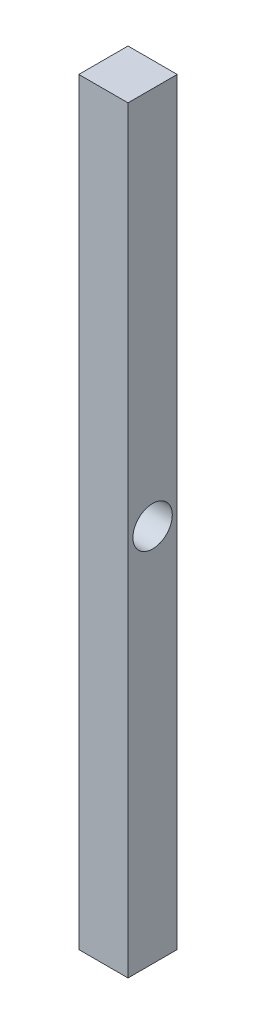
ISO-10303-21;
HEADER;
FILE_DESCRIPTION(('STEP AP214'),'2;1');
FILE_NAME('part.step','',(''),(''),'','','');
FILE_SCHEMA(('AUTOMOTIVE_DESIGN { 1 0 10303 214 1 1 1 1 }'));
ENDSEC;
DATA;
#1=APPLICATION_CONTEXT('core data for automotive mechanical design processes');
#2=APPLICATION_PROTOCOL_DEFINITION('international standard','automotive_design',2000,#1);
#3=PRODUCT_CONTEXT('',#1,'mechanical');
#4=PRODUCT('Part','Part','',(#3));
#5=PRODUCT_RELATED_PRODUCT_CATEGORY('part','',(#4));
#6=PRODUCT_DEFINITION_FORMATION('','',#4);
#7=PRODUCT_DEFINITION_CONTEXT('part definition',#1,'design');
#8=PRODUCT_DEFINITION('design','',#6,#7);
#9=PRODUCT_DEFINITION_SHAPE('','',#8);
#10=(LENGTH_UNIT() NAMED_UNIT(*) SI_UNIT(.MILLI.,.METRE.));
#11=(NAMED_UNIT(*) PLANE_ANGLE_UNIT() SI_UNIT($,.RADIAN.));
#12=(NAMED_UNIT(*) SI_UNIT($,.STERADIAN.) SOLID_ANGLE_UNIT());
#13=UNCERTAINTY_MEASURE_WITH_UNIT(LENGTH_MEASURE(1.E-05),#10,'distance_accuracy_value','');
#14=(GEOMETRIC_REPRESENTATION_CONTEXT(3) GLOBAL_UNCERTAINTY_ASSIGNED_CONTEXT((#13)) GLOBAL_UNIT_ASSIGNED_CONTEXT((#10,
#11,#12)) REPRESENTATION_CONTEXT('',''));
#15=CARTESIAN_POINT('',(0.,0.,0.));
#16=DIRECTION('',(0.,0.,1.));
#17=DIRECTION('',(1.,0.,0.));
#18=AXIS2_PLACEMENT_3D('',#15,#16,#17);
#19=CARTESIAN_POINT('',(5.,154.,-5.));
#20=DIRECTION('',(-1.,0.,0.));
#21=DIRECTION('',(0.,0.,1.));
#22=AXIS2_PLACEMENT_3D('',#19,#20,#21);
#23=PLANE('',#22);
#24=CARTESIAN_POINT('',(5.,77.,0.));
#25=DIRECTION('',(-1.,0.,0.));
#26=DIRECTION('',(0.,0.,1.));
#27=AXIS2_PLACEMENT_3D('',#24,#25,#26);
#28=CIRCLE('',#27,4.);
#29=CARTESIAN_POINT('',(5.,77.,3.99999999999999));
#30=VERTEX_POINT('',#29);
#31=EDGE_CURVE('E99',#30,#30,#28,.T.);
#32=ORIENTED_EDGE('',*,*,#31,.T.);
#33=EDGE_LOOP('',(#32));
#34=FACE_BOUND('',#33,.T.);
#35=DIRECTION('',(0.,0.,-1.));
#36=VECTOR('',#35,1.);
#37=CARTESIAN_POINT('',(5.,0.,-5.));
#38=LINE('',#37,#36);
#39=CARTESIAN_POINT('',(5.,0.,5.));
#40=VERTEX_POINT('',#39);
#41=CARTESIAN_POINT('',(5.,0.,-5.));
#42=VERTEX_POINT('',#41);
#43=EDGE_CURVE('E96',#40,#42,#38,.T.);
#44=ORIENTED_EDGE('',*,*,#43,.T.);
#45=DIRECTION('',(0.,-1.,0.));
#46=VECTOR('',#45,1.);
#47=CARTESIAN_POINT('',(5.,154.,-5.));
#48=LINE('',#47,#46);
#49=CARTESIAN_POINT('',(5.,154.,-5.));
#50=VERTEX_POINT('',#49);
#51=EDGE_CURVE('E11',#50,#42,#48,.T.);
#52=ORIENTED_EDGE('',*,*,#51,.F.);
#53=DIRECTION('',(0.,0.,-1.));
#54=VECTOR('',#53,1.);
#55=CARTESIAN_POINT('',(5.,154.,-5.));
#56=LINE('',#55,#54);
#57=CARTESIAN_POINT('',(5.,154.,5.));
#58=VERTEX_POINT('',#57);
#59=EDGE_CURVE('E84',#58,#50,#56,.T.);
#60=ORIENTED_EDGE('',*,*,#59,.F.);
#61=DIRECTION('',(0.,-1.,0.));
#62=VECTOR('',#61,1.);
#63=CARTESIAN_POINT('',(5.,154.,5.));
#64=LINE('',#63,#62);
#65=EDGE_CURVE('E92',#58,#40,#64,.T.);
#66=ORIENTED_EDGE('',*,*,#65,.T.);
#67=EDGE_LOOP('',(#44,#52,#60,#66));
#68=FACE_BOUND('',#67,.T.);
#69=ADVANCED_FACE('F33',(#34,#68),#23,.F.);
#70=CARTESIAN_POINT('',(-5.,154.,-5.));
#71=DIRECTION('',(0.,0.,1.));
#72=DIRECTION('',(1.,0.,0.));
#73=AXIS2_PLACEMENT_3D('',#70,#71,#72);
#74=PLANE('',#73);
#75=DIRECTION('',(-1.,0.,0.));
#76=VECTOR('',#75,1.);
#77=CARTESIAN_POINT('',(-5.,0.,-5.));
#78=LINE('',#77,#76);
#79=CARTESIAN_POINT('',(-5.,0.,-5.));
#80=VERTEX_POINT('',#79);
#81=EDGE_CURVE('E88',#42,#80,#78,.T.);
#82=ORIENTED_EDGE('',*,*,#81,.T.);
#83=DIRECTION('',(0.,-1.,0.));
#84=VECTOR('',#83,1.);
#85=CARTESIAN_POINT('',(-5.,154.,-5.));
#86=LINE('',#85,#84);
#87=CARTESIAN_POINT('',(-5.,154.,-5.));
#88=VERTEX_POINT('',#87);
#89=EDGE_CURVE('E41',#88,#80,#86,.T.);
#90=ORIENTED_EDGE('',*,*,#89,.F.);
#91=DIRECTION('',(-1.,0.,0.));
#92=VECTOR('',#91,1.);
#93=CARTESIAN_POINT('',(-5.,154.,-5.));
#94=LINE('',#93,#92);
#95=EDGE_CURVE('E79',#50,#88,#94,.T.);
#96=ORIENTED_EDGE('',*,*,#95,.F.);
#97=ORIENTED_EDGE('',*,*,#51,.T.);
#98=EDGE_LOOP('',(#82,#90,#96,#97));
#99=FACE_BOUND('',#98,.T.);
#100=ADVANCED_FACE('F87',(#99),#74,.F.);
#101=CARTESIAN_POINT('',(-5.,154.,-5.));
#102=DIRECTION('',(1.,0.,0.));
#103=DIRECTION('',(0.,0.,-1.));
#104=AXIS2_PLACEMENT_3D('',#101,#102,#103);
#105=PLANE('',#104);
#106=CARTESIAN_POINT('',(-5.,77.,0.));
#107=DIRECTION('',(1.,0.,0.));
#108=DIRECTION('',(0.,0.,-1.));
#109=AXIS2_PLACEMENT_3D('',#106,#107,#108);
#110=CIRCLE('',#109,4.);
#111=CARTESIAN_POINT('',(-5.,77.,-4.00000000000001));
#112=VERTEX_POINT('',#111);
#113=EDGE_CURVE('E112',#112,#112,#110,.T.);
#114=ORIENTED_EDGE('',*,*,#113,.T.);
#115=EDGE_LOOP('',(#114));
#116=FACE_BOUND('',#115,.T.);
#117=DIRECTION('',(0.,0.,1.));
#118=VECTOR('',#117,1.);
#119=CARTESIAN_POINT('',(-5.,0.,-5.));
#120=LINE('',#119,#118);
#121=CARTESIAN_POINT('',(-5.,0.,5.));
#122=VERTEX_POINT('',#121);
#123=EDGE_CURVE('E66',#80,#122,#120,.T.);
#124=ORIENTED_EDGE('',*,*,#123,.T.);
#125=DIRECTION('',(0.,-1.,0.));
#126=VECTOR('',#125,1.);
#127=CARTESIAN_POINT('',(-5.,154.,5.));
#128=LINE('',#127,#126);
#129=CARTESIAN_POINT('',(-5.,154.,5.));
#130=VERTEX_POINT('',#129);
#131=EDGE_CURVE('E89',#130,#122,#128,.T.);
#132=ORIENTED_EDGE('',*,*,#131,.F.);
#133=DIRECTION('',(0.,0.,1.));
#134=VECTOR('',#133,1.);
#135=CARTESIAN_POINT('',(-5.,154.,-5.));
#136=LINE('',#135,#134);
#137=EDGE_CURVE('E82',#88,#130,#136,.T.);
#138=ORIENTED_EDGE('',*,*,#137,.F.);
#139=ORIENTED_EDGE('',*,*,#89,.T.);
#140=EDGE_LOOP('',(#124,#132,#138,#139));
#141=FACE_BOUND('',#140,.T.);
#142=ADVANCED_FACE('F90',(#116,#141),#105,.F.);
#143=CARTESIAN_POINT('',(-5.,154.,5.));
#144=DIRECTION('',(0.,0.,-1.));
#145=DIRECTION('',(-1.,0.,0.));
#146=AXIS2_PLACEMENT_3D('',#143,#144,#145);
#147=PLANE('',#146);
#148=DIRECTION('',(1.,0.,0.));
#149=VECTOR('',#148,1.);
#150=CARTESIAN_POINT('',(-5.,0.,5.));
#151=LINE('',#150,#149);
#152=EDGE_CURVE('E72',#122,#40,#151,.T.);
#153=ORIENTED_EDGE('',*,*,#152,.T.);
#154=ORIENTED_EDGE('',*,*,#65,.F.);
#155=DIRECTION('',(1.,0.,0.));
#156=VECTOR('',#155,1.);
#157=CARTESIAN_POINT('',(-5.,154.,5.));
#158=LINE('',#157,#156);
#159=EDGE_CURVE('E49',#130,#58,#158,.T.);
#160=ORIENTED_EDGE('',*,*,#159,.F.);
#161=ORIENTED_EDGE('',*,*,#131,.T.);
#162=EDGE_LOOP('',(#153,#154,#160,#161));
#163=FACE_BOUND('',#162,.T.);
#164=ADVANCED_FACE('F104',(#163),#147,.F.);
#165=CARTESIAN_POINT('',(0.,154.,0.));
#166=DIRECTION('',(0.,1.,0.));
#167=DIRECTION('',(0.,0.,1.));
#168=AXIS2_PLACEMENT_3D('',#165,#166,#167);
#169=PLANE('',#168);
#170=ORIENTED_EDGE('',*,*,#59,.T.);
#171=ORIENTED_EDGE('',*,*,#95,.T.);
#172=ORIENTED_EDGE('',*,*,#137,.T.);
#173=ORIENTED_EDGE('',*,*,#159,.T.);
#174=EDGE_LOOP('',(#170,#171,#172,#173));
#175=FACE_BOUND('',#174,.T.);
#176=ADVANCED_FACE('F80',(#175),#169,.T.);
#177=CARTESIAN_POINT('',(0.,0.,0.));
#178=DIRECTION('',(0.,1.,0.));
#179=DIRECTION('',(0.,0.,1.));
#180=AXIS2_PLACEMENT_3D('',#177,#178,#179);
#181=PLANE('',#180);
#182=ORIENTED_EDGE('',*,*,#43,.F.);
#183=ORIENTED_EDGE('',*,*,#152,.F.);
#184=ORIENTED_EDGE('',*,*,#123,.F.);
#185=ORIENTED_EDGE('',*,*,#81,.F.);
#186=EDGE_LOOP('',(#182,#183,#184,#185));
#187=FACE_BOUND('',#186,.T.);
#188=ADVANCED_FACE('F107',(#187),#181,.F.);
#189=CARTESIAN_POINT('',(-5.,77.,0.));
#190=DIRECTION('',(1.,0.,0.));
#191=DIRECTION('',(0.,0.,-1.));
#192=AXIS2_PLACEMENT_3D('',#189,#190,#191);
#193=CYLINDRICAL_SURFACE('',#192,4.);
#194=ORIENTED_EDGE('',*,*,#113,.F.);
#195=EDGE_LOOP('',(#194));
#196=FACE_BOUND('',#195,.T.);
#197=ORIENTED_EDGE('',*,*,#31,.F.);
#198=EDGE_LOOP('',(#197));
#199=FACE_BOUND('',#198,.T.);
#200=ADVANCED_FACE('F117',(#196,#199),#193,.F.);
#201=CLOSED_SHELL('',(#69,#100,#142,#164,#176,#188,#200));
#202=MANIFOLD_SOLID_BREP('B2',#201);
#203=ADVANCED_BREP_SHAPE_REPRESENTATION('',(#18,#202),#14);
#204=SHAPE_DEFINITION_REPRESENTATION(#9,#203);
ENDSEC;
END-ISO-10303-21;
